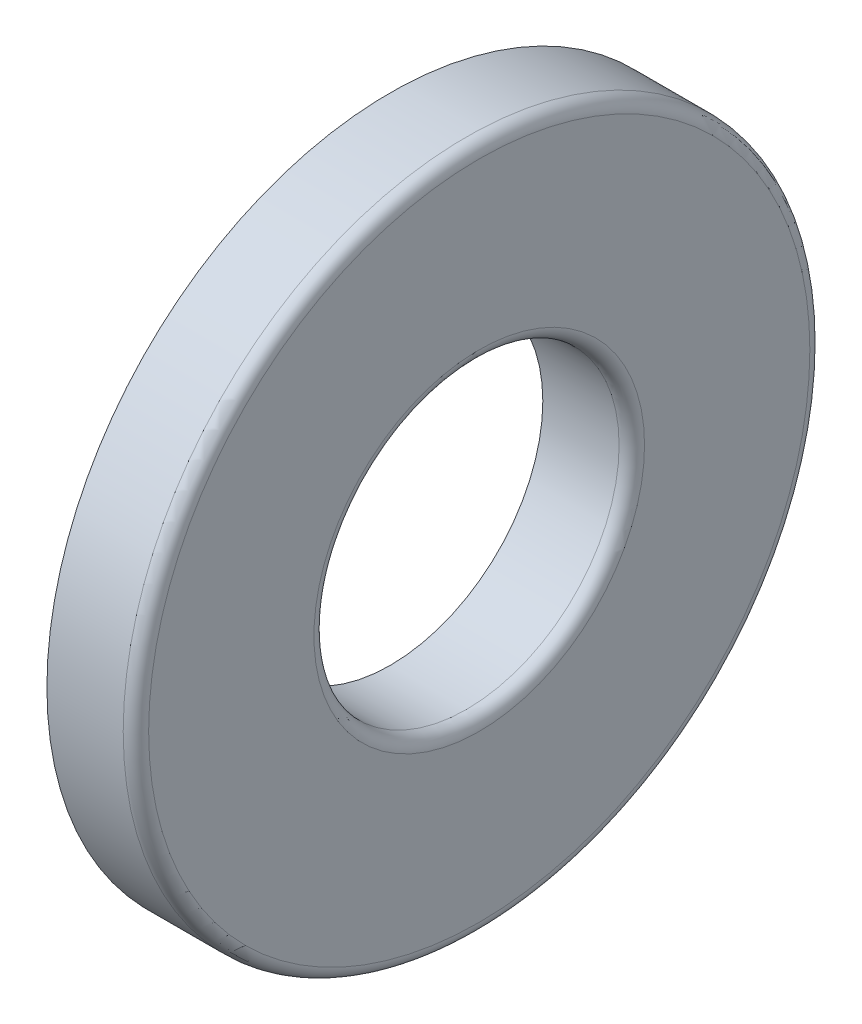
ISO-10303-21;
HEADER;
FILE_DESCRIPTION(('STEP AP214'),'2;1');
FILE_NAME('part.step','',(''),(''),'','','');
FILE_SCHEMA(('AUTOMOTIVE_DESIGN { 1 0 10303 214 1 1 1 1 }'));
ENDSEC;
DATA;
#1=APPLICATION_CONTEXT('core data for automotive mechanical design processes');
#2=APPLICATION_PROTOCOL_DEFINITION('international standard','automotive_design',2000,#1);
#3=PRODUCT_CONTEXT('',#1,'mechanical');
#4=PRODUCT('Part','Part','',(#3));
#5=PRODUCT_RELATED_PRODUCT_CATEGORY('part','',(#4));
#6=PRODUCT_DEFINITION_FORMATION('','',#4);
#7=PRODUCT_DEFINITION_CONTEXT('part definition',#1,'design');
#8=PRODUCT_DEFINITION('design','',#6,#7);
#9=PRODUCT_DEFINITION_SHAPE('','',#8);
#10=(LENGTH_UNIT() NAMED_UNIT(*) SI_UNIT(.MILLI.,.METRE.));
#11=(NAMED_UNIT(*) PLANE_ANGLE_UNIT() SI_UNIT($,.RADIAN.));
#12=(NAMED_UNIT(*) SI_UNIT($,.STERADIAN.) SOLID_ANGLE_UNIT());
#13=UNCERTAINTY_MEASURE_WITH_UNIT(LENGTH_MEASURE(1.E-05),#10,'distance_accuracy_value','');
#14=(GEOMETRIC_REPRESENTATION_CONTEXT(3) GLOBAL_UNCERTAINTY_ASSIGNED_CONTEXT((#13)) GLOBAL_UNIT_ASSIGNED_CONTEXT((#10,
#11,#12)) REPRESENTATION_CONTEXT('',''));
#15=CARTESIAN_POINT('',(0.,0.,0.));
#16=DIRECTION('',(0.,0.,1.));
#17=DIRECTION('',(1.,0.,0.));
#18=AXIS2_PLACEMENT_3D('',#15,#16,#17);
#19=CARTESIAN_POINT('',(3.5,13.5,0.));
#20=DIRECTION('',(1.,0.,0.));
#21=DIRECTION('',(0.,0.,-1.));
#22=AXIS2_PLACEMENT_3D('',#19,#20,#21);
#23=PLANE('',#22);
#24=CARTESIAN_POINT('',(3.5,0.,0.));
#25=DIRECTION('',(1.,0.,0.));
#26=DIRECTION('',(0.,0.,-1.));
#27=AXIS2_PLACEMENT_3D('',#24,#25,#26);
#28=CIRCLE('',#27,6.5);
#29=CARTESIAN_POINT('',(3.5,0.,-6.5));
#30=VERTEX_POINT('',#29);
#31=EDGE_CURVE('E10',#30,#30,#28,.F.);
#32=ORIENTED_EDGE('',*,*,#31,.T.);
#33=EDGE_LOOP('',(#32));
#34=FACE_BOUND('',#33,.T.);
#35=CARTESIAN_POINT('',(3.5,0.,0.));
#36=DIRECTION('',(1.,0.,0.));
#37=DIRECTION('',(0.,0.,-1.));
#38=AXIS2_PLACEMENT_3D('',#35,#36,#37);
#39=CIRCLE('',#38,13.);
#40=CARTESIAN_POINT('',(3.5,0.,-13.));
#41=VERTEX_POINT('',#40);
#42=EDGE_CURVE('E37',#41,#41,#39,.T.);
#43=ORIENTED_EDGE('',*,*,#42,.T.);
#44=EDGE_LOOP('',(#43));
#45=FACE_BOUND('',#44,.T.);
#46=ADVANCED_FACE('F27',(#34,#45),#23,.T.);
#47=CARTESIAN_POINT('',(-2.49999999999997,0.,0.));
#48=DIRECTION('',(-1.,0.,0.));
#49=DIRECTION('',(0.,0.,1.));
#50=AXIS2_PLACEMENT_3D('',#47,#48,#49);
#51=CYLINDRICAL_SURFACE('',#50,13.5);
#52=CARTESIAN_POINT('',(3.,0.,0.));
#53=DIRECTION('',(1.,0.,0.));
#54=DIRECTION('',(0.,0.,-1.));
#55=AXIS2_PLACEMENT_3D('',#52,#53,#54);
#56=CIRCLE('',#55,13.5);
#57=CARTESIAN_POINT('',(3.,0.,-13.5));
#58=VERTEX_POINT('',#57);
#59=EDGE_CURVE('E41',#58,#58,#56,.F.);
#60=ORIENTED_EDGE('',*,*,#59,.T.);
#61=EDGE_LOOP('',(#60));
#62=FACE_BOUND('',#61,.T.);
#63=CARTESIAN_POINT('',(0.,0.,0.));
#64=DIRECTION('',(-1.,0.,0.));
#65=DIRECTION('',(0.,0.,1.));
#66=AXIS2_PLACEMENT_3D('',#63,#64,#65);
#67=CIRCLE('',#66,13.5);
#68=CARTESIAN_POINT('',(0.,0.,13.5));
#69=VERTEX_POINT('',#68);
#70=EDGE_CURVE('E46',#69,#69,#67,.T.);
#71=ORIENTED_EDGE('',*,*,#70,.F.);
#72=EDGE_LOOP('',(#71));
#73=FACE_BOUND('',#72,.T.);
#74=ADVANCED_FACE('F76',(#62,#73),#51,.T.);
#75=CARTESIAN_POINT('',(0.,10.6583123951777,0.));
#76=DIRECTION('',(-1.,0.,0.));
#77=DIRECTION('',(0.,0.,1.));
#78=AXIS2_PLACEMENT_3D('',#75,#76,#77);
#79=PLANE('',#78);
#80=ORIENTED_EDGE('',*,*,#70,.T.);
#81=EDGE_LOOP('',(#80));
#82=FACE_BOUND('',#81,.T.);
#83=CARTESIAN_POINT('',(0.,0.,0.));
#84=DIRECTION('',(-1.,0.,0.));
#85=DIRECTION('',(0.,0.,1.));
#86=AXIS2_PLACEMENT_3D('',#83,#84,#85);
#87=CIRCLE('',#86,10.6583123951777);
#88=CARTESIAN_POINT('',(0.,0.,10.6583123951777));
#89=VERTEX_POINT('',#88);
#90=EDGE_CURVE('E49',#89,#89,#87,.T.);
#91=ORIENTED_EDGE('',*,*,#90,.F.);
#92=EDGE_LOOP('',(#91));
#93=FACE_BOUND('',#92,.T.);
#94=ADVANCED_FACE('F80',(#82,#93),#79,.T.);
#95=CARTESIAN_POINT('',(-2.5,0.,0.));
#96=DIRECTION('',(-1.,0.,0.));
#97=DIRECTION('',(0.,0.,1.));
#98=AXIS2_PLACEMENT_3D('',#95,#96,#97);
#99=TOROIDAL_SURFACE('',#98,9.,3.);
#100=ORIENTED_EDGE('',*,*,#90,.T.);
#101=EDGE_LOOP('',(#100));
#102=FACE_BOUND('',#101,.T.);
#103=CARTESIAN_POINT('',(0.,0.,0.));
#104=DIRECTION('',(-1.,0.,0.));
#105=DIRECTION('',(0.,0.,1.));
#106=AXIS2_PLACEMENT_3D('',#103,#104,#105);
#107=CIRCLE('',#106,7.3416876048223);
#108=CARTESIAN_POINT('',(0.,0.,7.3416876048223));
#109=VERTEX_POINT('',#108);
#110=EDGE_CURVE('E52',#109,#109,#107,.T.);
#111=ORIENTED_EDGE('',*,*,#110,.F.);
#112=EDGE_LOOP('',(#111));
#113=FACE_BOUND('',#112,.T.);
#114=ADVANCED_FACE('F91',(#102,#113),#99,.F.);
#115=CARTESIAN_POINT('',(0.,0.,0.));
#116=DIRECTION('',(-1.,0.,0.));
#117=DIRECTION('',(0.,0.,1.));
#118=AXIS2_PLACEMENT_3D('',#115,#116,#117);
#119=PLANE('',#118);
#120=CARTESIAN_POINT('',(0.,0.,0.));
#121=DIRECTION('',(1.,0.,0.));
#122=DIRECTION('',(0.,0.,-1.));
#123=AXIS2_PLACEMENT_3D('',#120,#121,#122);
#124=CIRCLE('',#123,6.);
#125=CARTESIAN_POINT('',(0.,0.,-6.));
#126=VERTEX_POINT('',#125);
#127=EDGE_CURVE('E55',#126,#126,#124,.T.);
#128=ORIENTED_EDGE('',*,*,#127,.T.);
#129=EDGE_LOOP('',(#128));
#130=FACE_BOUND('',#129,.T.);
#131=ORIENTED_EDGE('',*,*,#110,.T.);
#132=EDGE_LOOP('',(#131));
#133=FACE_BOUND('',#132,.T.);
#134=ADVANCED_FACE('F59',(#130,#133),#119,.T.);
#135=CARTESIAN_POINT('',(3.,0.,0.));
#136=DIRECTION('',(1.,0.,0.));
#137=DIRECTION('',(0.,0.,-1.));
#138=AXIS2_PLACEMENT_3D('',#135,#136,#137);
#139=TOROIDAL_SURFACE('',#138,13.,0.5);
#140=ORIENTED_EDGE('',*,*,#42,.F.);
#141=EDGE_LOOP('',(#140));
#142=FACE_BOUND('',#141,.T.);
#143=ORIENTED_EDGE('',*,*,#59,.F.);
#144=EDGE_LOOP('',(#143));
#145=FACE_BOUND('',#144,.T.);
#146=ADVANCED_FACE('F65',(#142,#145),#139,.T.);
#147=CARTESIAN_POINT('',(0.,0.,0.));
#148=DIRECTION('',(1.,0.,0.));
#149=DIRECTION('',(0.,0.,-1.));
#150=AXIS2_PLACEMENT_3D('',#147,#148,#149);
#151=CYLINDRICAL_SURFACE('',#150,6.);
#152=CARTESIAN_POINT('',(3.,0.,0.));
#153=DIRECTION('',(1.,0.,0.));
#154=DIRECTION('',(0.,0.,-1.));
#155=AXIS2_PLACEMENT_3D('',#152,#153,#154);
#156=CIRCLE('',#155,6.);
#157=CARTESIAN_POINT('',(3.,0.,-6.));
#158=VERTEX_POINT('',#157);
#159=EDGE_CURVE('E33',#158,#158,#156,.T.);
#160=ORIENTED_EDGE('',*,*,#159,.T.);
#161=EDGE_LOOP('',(#160));
#162=FACE_BOUND('',#161,.T.);
#163=ORIENTED_EDGE('',*,*,#127,.F.);
#164=EDGE_LOOP('',(#163));
#165=FACE_BOUND('',#164,.T.);
#166=ADVANCED_FACE('F62',(#162,#165),#151,.F.);
#167=CARTESIAN_POINT('',(3.,0.,0.));
#168=DIRECTION('',(1.,0.,0.));
#169=DIRECTION('',(0.,0.,-1.));
#170=AXIS2_PLACEMENT_3D('',#167,#168,#169);
#171=TOROIDAL_SURFACE('',#170,6.5,0.5);
#172=ORIENTED_EDGE('',*,*,#31,.F.);
#173=EDGE_LOOP('',(#172));
#174=FACE_BOUND('',#173,.T.);
#175=ORIENTED_EDGE('',*,*,#159,.F.);
#176=EDGE_LOOP('',(#175));
#177=FACE_BOUND('',#176,.T.);
#178=ADVANCED_FACE('F64',(#174,#177),#171,.T.);
#179=CLOSED_SHELL('',(#46,#74,#94,#114,#134,#146,#166,#178));
#180=MANIFOLD_SOLID_BREP('B2',#179);
#181=ADVANCED_BREP_SHAPE_REPRESENTATION('',(#18,#180),#14);
#182=SHAPE_DEFINITION_REPRESENTATION(#9,#181);
ENDSEC;
END-ISO-10303-21;
